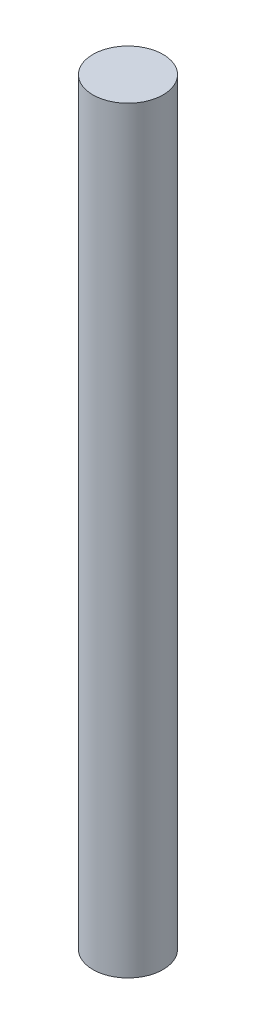
ISO-10303-21;
HEADER;
FILE_DESCRIPTION(('STEP AP214'),'2;1');
FILE_NAME('part.step','',(''),(''),'','','');
FILE_SCHEMA(('AUTOMOTIVE_DESIGN { 1 0 10303 214 1 1 1 1 }'));
ENDSEC;
DATA;
#1=APPLICATION_CONTEXT('core data for automotive mechanical design processes');
#2=APPLICATION_PROTOCOL_DEFINITION('international standard','automotive_design',2000,#1);
#3=PRODUCT_CONTEXT('',#1,'mechanical');
#4=PRODUCT('Part','Part','',(#3));
#5=PRODUCT_RELATED_PRODUCT_CATEGORY('part','',(#4));
#6=PRODUCT_DEFINITION_FORMATION('','',#4);
#7=PRODUCT_DEFINITION_CONTEXT('part definition',#1,'design');
#8=PRODUCT_DEFINITION('design','',#6,#7);
#9=PRODUCT_DEFINITION_SHAPE('','',#8);
#10=(LENGTH_UNIT() NAMED_UNIT(*) SI_UNIT(.MILLI.,.METRE.));
#11=(NAMED_UNIT(*) PLANE_ANGLE_UNIT() SI_UNIT($,.RADIAN.));
#12=(NAMED_UNIT(*) SI_UNIT($,.STERADIAN.) SOLID_ANGLE_UNIT());
#13=UNCERTAINTY_MEASURE_WITH_UNIT(LENGTH_MEASURE(1.E-05),#10,'distance_accuracy_value','');
#14=(GEOMETRIC_REPRESENTATION_CONTEXT(3) GLOBAL_UNCERTAINTY_ASSIGNED_CONTEXT((#13)) GLOBAL_UNIT_ASSIGNED_CONTEXT((#10,
#11,#12)) REPRESENTATION_CONTEXT('',''));
#15=CARTESIAN_POINT('',(0.,0.,0.));
#16=DIRECTION('',(0.,0.,1.));
#17=DIRECTION('',(1.,0.,0.));
#18=AXIS2_PLACEMENT_3D('',#15,#16,#17);
#19=CARTESIAN_POINT('',(0.,540.,0.));
#20=DIRECTION('',(0.,-1.,0.));
#21=DIRECTION('',(0.,0.,-1.));
#22=AXIS2_PLACEMENT_3D('',#19,#20,#21);
#23=CYLINDRICAL_SURFACE('',#22,25.);
#24=CARTESIAN_POINT('',(0.,540.,0.));
#25=DIRECTION('',(0.,1.,0.));
#26=DIRECTION('',(0.,0.,1.));
#27=AXIS2_PLACEMENT_3D('',#24,#25,#26);
#28=CIRCLE('',#27,25.);
#29=CARTESIAN_POINT('',(0.,540.,25.));
#30=VERTEX_POINT('',#29);
#31=EDGE_CURVE('E10',#30,#30,#28,.T.);
#32=ORIENTED_EDGE('',*,*,#31,.F.);
#33=EDGE_LOOP('',(#32));
#34=FACE_BOUND('',#33,.T.);
#35=CARTESIAN_POINT('',(0.,0.,0.));
#36=DIRECTION('',(0.,1.,0.));
#37=DIRECTION('',(0.,0.,1.));
#38=AXIS2_PLACEMENT_3D('',#35,#36,#37);
#39=CIRCLE('',#38,25.);
#40=CARTESIAN_POINT('',(0.,0.,25.));
#41=VERTEX_POINT('',#40);
#42=EDGE_CURVE('E36',#41,#41,#39,.T.);
#43=ORIENTED_EDGE('',*,*,#42,.T.);
#44=EDGE_LOOP('',(#43));
#45=FACE_BOUND('',#44,.T.);
#46=ADVANCED_FACE('F33',(#34,#45),#23,.T.);
#47=CARTESIAN_POINT('',(0.,540.,0.));
#48=DIRECTION('',(0.,1.,0.));
#49=DIRECTION('',(0.,0.,1.));
#50=AXIS2_PLACEMENT_3D('',#47,#48,#49);
#51=PLANE('',#50);
#52=ORIENTED_EDGE('',*,*,#31,.T.);
#53=EDGE_LOOP('',(#52));
#54=FACE_BOUND('',#53,.T.);
#55=ADVANCED_FACE('F48',(#54),#51,.T.);
#56=CARTESIAN_POINT('',(0.,0.,0.));
#57=DIRECTION('',(0.,1.,0.));
#58=DIRECTION('',(0.,0.,1.));
#59=AXIS2_PLACEMENT_3D('',#56,#57,#58);
#60=PLANE('',#59);
#61=ORIENTED_EDGE('',*,*,#42,.F.);
#62=EDGE_LOOP('',(#61));
#63=FACE_BOUND('',#62,.T.);
#64=ADVANCED_FACE('F46',(#63),#60,.F.);
#65=CLOSED_SHELL('',(#46,#55,#64));
#66=MANIFOLD_SOLID_BREP('B2',#65);
#67=ADVANCED_BREP_SHAPE_REPRESENTATION('',(#18,#66),#14);
#68=SHAPE_DEFINITION_REPRESENTATION(#9,#67);
ENDSEC;
END-ISO-10303-21;
